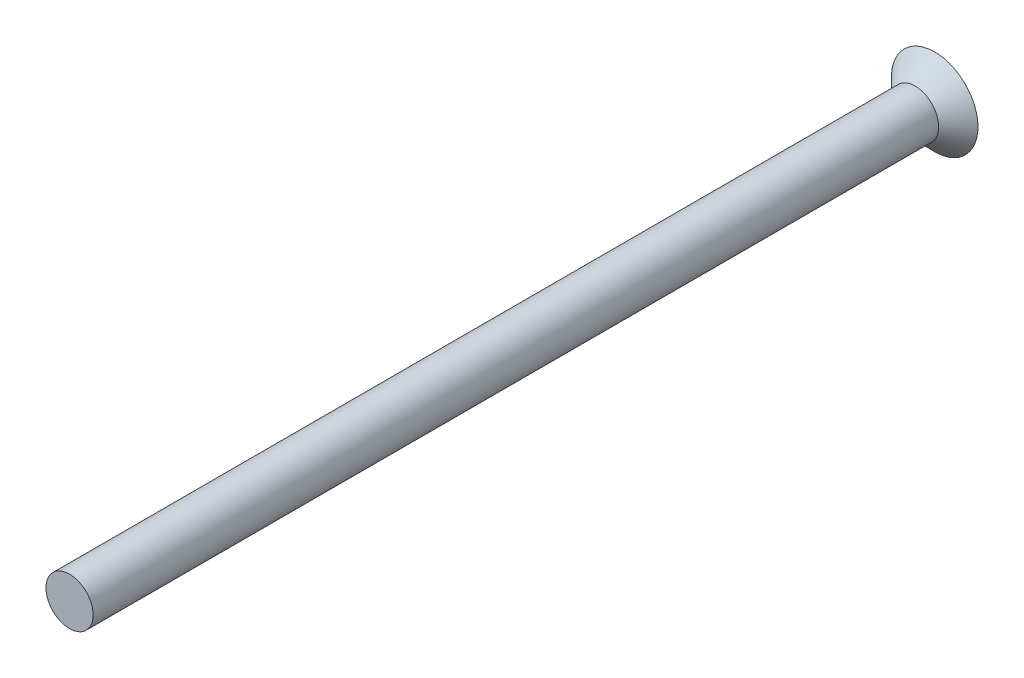
ISO-10303-21;
HEADER;
FILE_DESCRIPTION(('STEP AP214'),'2;1');
FILE_NAME('part.step','',(''),(''),'','','');
FILE_SCHEMA(('AUTOMOTIVE_DESIGN { 1 0 10303 214 1 1 1 1 }'));
ENDSEC;
DATA;
#1=APPLICATION_CONTEXT('core data for automotive mechanical design processes');
#2=APPLICATION_PROTOCOL_DEFINITION('international standard','automotive_design',2000,#1);
#3=PRODUCT_CONTEXT('',#1,'mechanical');
#4=PRODUCT('Part','Part','',(#3));
#5=PRODUCT_RELATED_PRODUCT_CATEGORY('part','',(#4));
#6=PRODUCT_DEFINITION_FORMATION('','',#4);
#7=PRODUCT_DEFINITION_CONTEXT('part definition',#1,'design');
#8=PRODUCT_DEFINITION('design','',#6,#7);
#9=PRODUCT_DEFINITION_SHAPE('','',#8);
#10=(LENGTH_UNIT() NAMED_UNIT(*) SI_UNIT(.MILLI.,.METRE.));
#11=(NAMED_UNIT(*) PLANE_ANGLE_UNIT() SI_UNIT($,.RADIAN.));
#12=(NAMED_UNIT(*) SI_UNIT($,.STERADIAN.) SOLID_ANGLE_UNIT());
#13=UNCERTAINTY_MEASURE_WITH_UNIT(LENGTH_MEASURE(1.E-05),#10,'distance_accuracy_value','');
#14=(GEOMETRIC_REPRESENTATION_CONTEXT(3) GLOBAL_UNCERTAINTY_ASSIGNED_CONTEXT((#13)) GLOBAL_UNIT_ASSIGNED_CONTEXT((#10,
#11,#12)) REPRESENTATION_CONTEXT('',''));
#15=CARTESIAN_POINT('',(0.,0.,0.));
#16=DIRECTION('',(0.,0.,1.));
#17=DIRECTION('',(1.,0.,0.));
#18=AXIS2_PLACEMENT_3D('',#15,#16,#17);
#19=CARTESIAN_POINT('',(0.,0.,55.));
#20=DIRECTION('',(0.,0.,-1.));
#21=DIRECTION('',(-1.,0.,0.));
#22=AXIS2_PLACEMENT_3D('',#19,#20,#21);
#23=CYLINDRICAL_SURFACE('',#22,1.5);
#24=CARTESIAN_POINT('',(0.,0.,55.));
#25=DIRECTION('',(0.,0.,1.));
#26=DIRECTION('',(1.,0.,0.));
#27=AXIS2_PLACEMENT_3D('',#24,#25,#26);
#28=CIRCLE('',#27,1.5);
#29=CARTESIAN_POINT('',(1.5,0.,55.));
#30=VERTEX_POINT('',#29);
#31=EDGE_CURVE('E10',#30,#30,#28,.T.);
#32=ORIENTED_EDGE('',*,*,#31,.F.);
#33=EDGE_LOOP('',(#32));
#34=FACE_BOUND('',#33,.T.);
#35=CARTESIAN_POINT('',(0.,0.,1.25));
#36=DIRECTION('',(0.,0.,1.));
#37=DIRECTION('',(1.,0.,0.));
#38=AXIS2_PLACEMENT_3D('',#35,#36,#37);
#39=CIRCLE('',#38,1.5);
#40=CARTESIAN_POINT('',(1.5,0.,1.25));
#41=VERTEX_POINT('',#40);
#42=EDGE_CURVE('E43',#41,#41,#39,.T.);
#43=ORIENTED_EDGE('',*,*,#42,.T.);
#44=EDGE_LOOP('',(#43));
#45=FACE_BOUND('',#44,.T.);
#46=ADVANCED_FACE('F37',(#34,#45),#23,.T.);
#47=CARTESIAN_POINT('',(0.,0.,55.));
#48=DIRECTION('',(0.,0.,1.));
#49=DIRECTION('',(1.,0.,0.));
#50=AXIS2_PLACEMENT_3D('',#47,#48,#49);
#51=PLANE('',#50);
#52=ORIENTED_EDGE('',*,*,#31,.T.);
#53=EDGE_LOOP('',(#52));
#54=FACE_BOUND('',#53,.T.);
#55=ADVANCED_FACE('F62',(#54),#51,.T.);
#56=CARTESIAN_POINT('',(0.,0.,0.));
#57=DIRECTION('',(0.,0.,-1.));
#58=DIRECTION('',(1.,0.,0.));
#59=AXIS2_PLACEMENT_3D('',#56,#57,#58);
#60=CONICAL_SURFACE('',#59,2.75,0.785398163397448);
#61=ORIENTED_EDGE('',*,*,#42,.F.);
#62=EDGE_LOOP('',(#61));
#63=FACE_BOUND('',#62,.T.);
#64=CARTESIAN_POINT('',(0.,0.,0.));
#65=DIRECTION('',(0.,0.,1.));
#66=DIRECTION('',(1.,0.,0.));
#67=AXIS2_PLACEMENT_3D('',#64,#65,#66);
#68=CIRCLE('',#67,2.75);
#69=CARTESIAN_POINT('',(2.75,0.,0.));
#70=VERTEX_POINT('',#69);
#71=EDGE_CURVE('E47',#70,#70,#68,.T.);
#72=ORIENTED_EDGE('',*,*,#71,.T.);
#73=EDGE_LOOP('',(#72));
#74=FACE_BOUND('',#73,.T.);
#75=ADVANCED_FACE('F54',(#63,#74),#60,.T.);
#76=CARTESIAN_POINT('',(0.,0.,0.));
#77=DIRECTION('',(0.,0.,1.));
#78=DIRECTION('',(1.,0.,0.));
#79=AXIS2_PLACEMENT_3D('',#76,#77,#78);
#80=PLANE('',#79);
#81=ORIENTED_EDGE('',*,*,#71,.F.);
#82=EDGE_LOOP('',(#81));
#83=FACE_BOUND('',#82,.T.);
#84=ADVANCED_FACE('F56',(#83),#80,.F.);
#85=CLOSED_SHELL('',(#46,#55,#75,#84));
#86=MANIFOLD_SOLID_BREP('B2',#85);
#87=ADVANCED_BREP_SHAPE_REPRESENTATION('',(#18,#86),#14);
#88=SHAPE_DEFINITION_REPRESENTATION(#9,#87);
ENDSEC;
END-ISO-10303-21;
